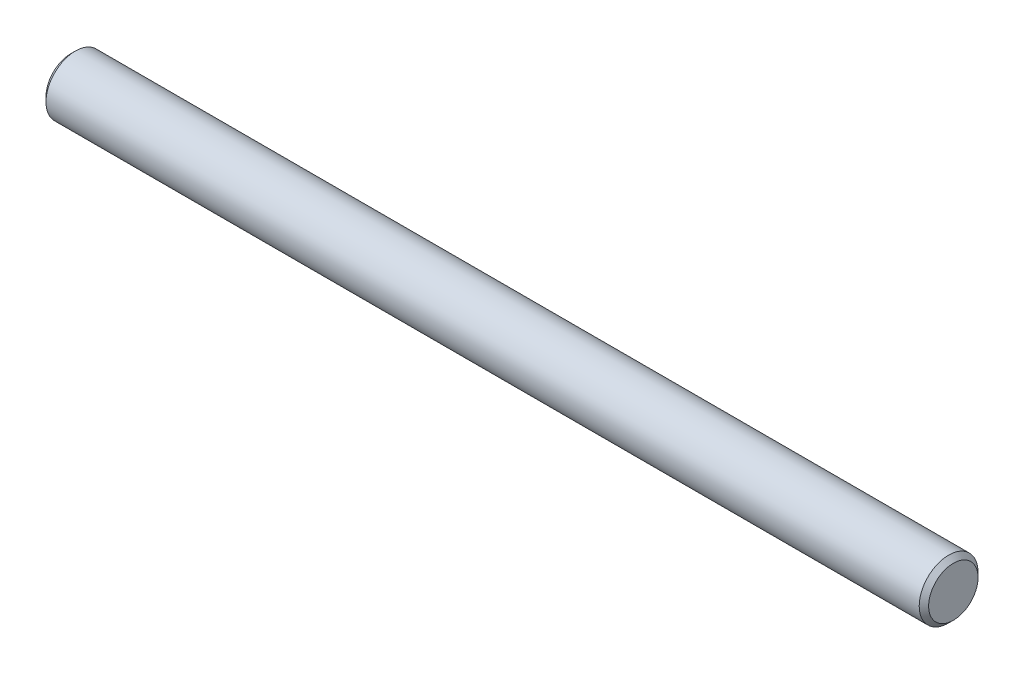
ISO-10303-21;
HEADER;
FILE_DESCRIPTION(('STEP AP214'),'2;1');
FILE_NAME('part.step','',(''),(''),'','','');
FILE_SCHEMA(('AUTOMOTIVE_DESIGN { 1 0 10303 214 1 1 1 1 }'));
ENDSEC;
DATA;
#1=APPLICATION_CONTEXT('core data for automotive mechanical design processes');
#2=APPLICATION_PROTOCOL_DEFINITION('international standard','automotive_design',2000,#1);
#3=PRODUCT_CONTEXT('',#1,'mechanical');
#4=PRODUCT('Part','Part','',(#3));
#5=PRODUCT_RELATED_PRODUCT_CATEGORY('part','',(#4));
#6=PRODUCT_DEFINITION_FORMATION('','',#4);
#7=PRODUCT_DEFINITION_CONTEXT('part definition',#1,'design');
#8=PRODUCT_DEFINITION('design','',#6,#7);
#9=PRODUCT_DEFINITION_SHAPE('','',#8);
#10=(LENGTH_UNIT() NAMED_UNIT(*) SI_UNIT(.MILLI.,.METRE.));
#11=(NAMED_UNIT(*) PLANE_ANGLE_UNIT() SI_UNIT($,.RADIAN.));
#12=(NAMED_UNIT(*) SI_UNIT($,.STERADIAN.) SOLID_ANGLE_UNIT());
#13=UNCERTAINTY_MEASURE_WITH_UNIT(LENGTH_MEASURE(1.E-05),#10,'distance_accuracy_value','');
#14=(GEOMETRIC_REPRESENTATION_CONTEXT(3) GLOBAL_UNCERTAINTY_ASSIGNED_CONTEXT((#13)) GLOBAL_UNIT_ASSIGNED_CONTEXT((#10,
#11,#12)) REPRESENTATION_CONTEXT('',''));
#15=CARTESIAN_POINT('',(0.,0.,0.));
#16=DIRECTION('',(0.,0.,1.));
#17=DIRECTION('',(1.,0.,0.));
#18=AXIS2_PLACEMENT_3D('',#15,#16,#17);
#19=CARTESIAN_POINT('',(23.8125,0.,0.));
#20=DIRECTION('',(1.,0.,0.));
#21=DIRECTION('',(0.,0.,-1.));
#22=AXIS2_PLACEMENT_3D('',#19,#20,#21);
#23=PLANE('',#22);
#24=CARTESIAN_POINT('',(23.8125000000196,0.,0.));
#25=DIRECTION('',(-1.,0.,0.));
#26=DIRECTION('',(0.,0.,1.));
#27=AXIS2_PLACEMENT_3D('',#24,#25,#26);
#28=CIRCLE('',#27,1.33350000004384);
#29=CARTESIAN_POINT('',(23.8125000000196,0.,1.33350000004384));
#30=VERTEX_POINT('',#29);
#31=EDGE_CURVE('E18',#30,#30,#28,.T.);
#32=ORIENTED_EDGE('',*,*,#31,.F.);
#33=EDGE_LOOP('',(#32));
#34=FACE_BOUND('',#33,.T.);
#35=ADVANCED_FACE('F15',(#34),#23,.T.);
#36=CARTESIAN_POINT('',(-23.8125,0.,0.));
#37=DIRECTION('',(1.,0.,0.));
#38=DIRECTION('',(0.,0.,-1.));
#39=AXIS2_PLACEMENT_3D('',#36,#37,#38);
#40=PLANE('',#39);
#41=CARTESIAN_POINT('',(-23.8125000000196,0.,0.));
#42=DIRECTION('',(1.,0.,0.));
#43=DIRECTION('',(0.,0.,-1.));
#44=AXIS2_PLACEMENT_3D('',#41,#42,#43);
#45=CIRCLE('',#44,1.33350000004384);
#46=CARTESIAN_POINT('',(-23.8125000000196,0.,-1.33350000004384));
#47=VERTEX_POINT('',#46);
#48=EDGE_CURVE('E27',#47,#47,#45,.T.);
#49=ORIENTED_EDGE('',*,*,#48,.F.);
#50=EDGE_LOOP('',(#49));
#51=FACE_BOUND('',#50,.T.);
#52=ADVANCED_FACE('F38',(#51),#40,.F.);
#53=CARTESIAN_POINT('',(23.5585000000356,0.,0.));
#54=DIRECTION('',(-1.,0.,0.));
#55=DIRECTION('',(0.,0.,1.));
#56=AXIS2_PLACEMENT_3D('',#53,#54,#55);
#57=CONICAL_SURFACE('',#56,1.58750000008467,0.785398163509345);
#58=CARTESIAN_POINT('',(23.5585,0.,0.));
#59=DIRECTION('',(-1.,0.,0.));
#60=DIRECTION('',(0.,0.,1.));
#61=AXIS2_PLACEMENT_3D('',#58,#59,#60);
#62=CIRCLE('',#61,1.5875);
#63=CARTESIAN_POINT('',(23.5585,0.,1.5875));
#64=VERTEX_POINT('',#63);
#65=EDGE_CURVE('E22',#64,#64,#62,.T.);
#66=ORIENTED_EDGE('',*,*,#65,.F.);
#67=EDGE_LOOP('',(#66));
#68=FACE_BOUND('',#67,.T.);
#69=ORIENTED_EDGE('',*,*,#31,.T.);
#70=EDGE_LOOP('',(#69));
#71=FACE_BOUND('',#70,.T.);
#72=ADVANCED_FACE('F35',(#68,#71),#57,.T.);
#73=CARTESIAN_POINT('',(-23.5585000000356,0.,0.));
#74=DIRECTION('',(1.,0.,0.));
#75=DIRECTION('',(0.,0.,-1.));
#76=AXIS2_PLACEMENT_3D('',#73,#74,#75);
#77=CONICAL_SURFACE('',#76,1.58749999997099,0.785398163285552);
#78=CARTESIAN_POINT('',(-23.5585,0.,0.));
#79=DIRECTION('',(-1.,0.,0.));
#80=DIRECTION('',(0.,0.,1.));
#81=AXIS2_PLACEMENT_3D('',#78,#79,#80);
#82=CIRCLE('',#81,1.5875);
#83=CARTESIAN_POINT('',(-23.5585,0.,1.5875));
#84=VERTEX_POINT('',#83);
#85=EDGE_CURVE('E10',#84,#84,#82,.F.);
#86=ORIENTED_EDGE('',*,*,#85,.F.);
#87=EDGE_LOOP('',(#86));
#88=FACE_BOUND('',#87,.T.);
#89=ORIENTED_EDGE('',*,*,#48,.T.);
#90=EDGE_LOOP('',(#89));
#91=FACE_BOUND('',#90,.T.);
#92=ADVANCED_FACE('F46',(#88,#91),#77,.T.);
#93=CARTESIAN_POINT('',(23.8125,0.,0.));
#94=DIRECTION('',(-1.,0.,0.));
#95=DIRECTION('',(0.,0.,1.));
#96=AXIS2_PLACEMENT_3D('',#93,#94,#95);
#97=CYLINDRICAL_SURFACE('',#96,1.5875);
#98=ORIENTED_EDGE('',*,*,#85,.T.);
#99=EDGE_LOOP('',(#98));
#100=FACE_BOUND('',#99,.T.);
#101=ORIENTED_EDGE('',*,*,#65,.T.);
#102=EDGE_LOOP('',(#101));
#103=FACE_BOUND('',#102,.T.);
#104=ADVANCED_FACE('F44',(#100,#103),#97,.T.);
#105=CLOSED_SHELL('',(#35,#52,#72,#92,#104));
#106=MANIFOLD_SOLID_BREP('B1',#105);
#107=ADVANCED_BREP_SHAPE_REPRESENTATION('',(#18,#106),#14);
#108=SHAPE_DEFINITION_REPRESENTATION(#9,#107);
ENDSEC;
END-ISO-10303-21;
